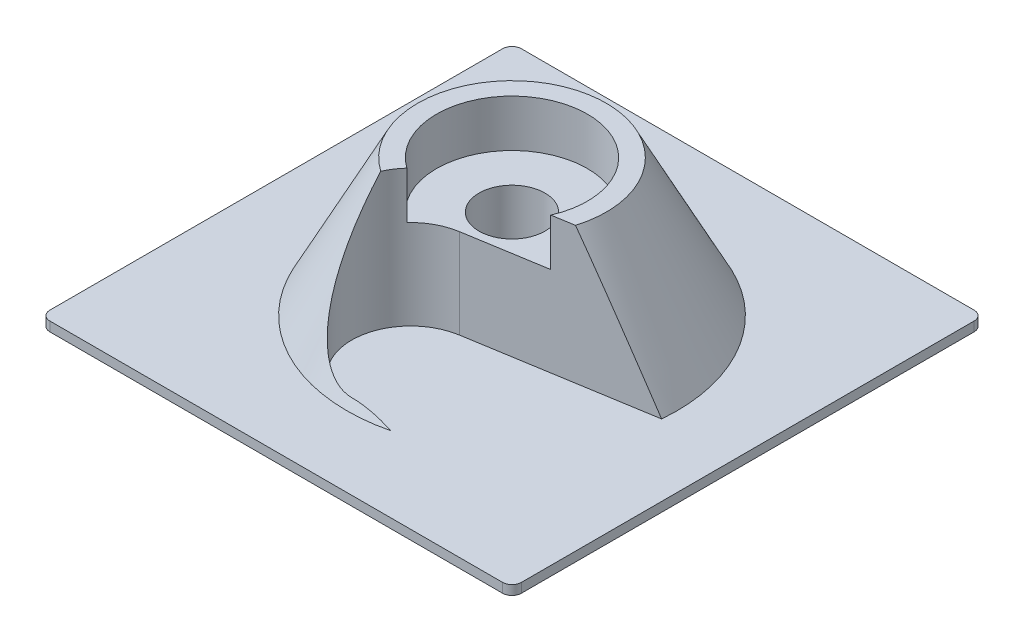
ISO-10303-21;
HEADER;
FILE_DESCRIPTION(('STEP AP214'),'2;1');
FILE_NAME('part.step','',(''),(''),'','','');
FILE_SCHEMA(('AUTOMOTIVE_DESIGN { 1 0 10303 214 1 1 1 1 }'));
ENDSEC;
DATA;
#1=APPLICATION_CONTEXT('core data for automotive mechanical design processes');
#2=APPLICATION_PROTOCOL_DEFINITION('international standard','automotive_design',2000,#1);
#3=PRODUCT_CONTEXT('',#1,'mechanical');
#4=PRODUCT('Part','Part','',(#3));
#5=PRODUCT_RELATED_PRODUCT_CATEGORY('part','',(#4));
#6=PRODUCT_DEFINITION_FORMATION('','',#4);
#7=PRODUCT_DEFINITION_CONTEXT('part definition',#1,'design');
#8=PRODUCT_DEFINITION('design','',#6,#7);
#9=PRODUCT_DEFINITION_SHAPE('','',#8);
#10=(LENGTH_UNIT() NAMED_UNIT(*) SI_UNIT(.MILLI.,.METRE.));
#11=(NAMED_UNIT(*) PLANE_ANGLE_UNIT() SI_UNIT($,.RADIAN.));
#12=(NAMED_UNIT(*) SI_UNIT($,.STERADIAN.) SOLID_ANGLE_UNIT());
#13=UNCERTAINTY_MEASURE_WITH_UNIT(LENGTH_MEASURE(1.E-05),#10,'distance_accuracy_value','');
#14=(GEOMETRIC_REPRESENTATION_CONTEXT(3) GLOBAL_UNCERTAINTY_ASSIGNED_CONTEXT((#13)) GLOBAL_UNIT_ASSIGNED_CONTEXT((#10,
#11,#12)) REPRESENTATION_CONTEXT('',''));
#15=CARTESIAN_POINT('',(0.,0.,0.));
#16=DIRECTION('',(0.,0.,1.));
#17=DIRECTION('',(1.,0.,0.));
#18=AXIS2_PLACEMENT_3D('',#15,#16,#17);
#19=CARTESIAN_POINT('',(24.,0.5,-24.));
#20=DIRECTION('',(0.,-1.,0.));
#21=DIRECTION('',(0.,0.,-1.));
#22=AXIS2_PLACEMENT_3D('',#19,#20,#21);
#23=PLANE('',#22);
#24=DIRECTION('',(0.,0.,-1.));
#25=VECTOR('',#24,1.);
#26=CARTESIAN_POINT('',(25.,0.5,-24.));
#27=LINE('',#26,#25);
#28=CARTESIAN_POINT('',(25.,0.5,24.));
#29=VERTEX_POINT('',#28);
#30=CARTESIAN_POINT('',(25.,0.5,-24.));
#31=VERTEX_POINT('',#30);
#32=EDGE_CURVE('E225',#29,#31,#27,.T.);
#33=ORIENTED_EDGE('',*,*,#32,.T.);
#34=CARTESIAN_POINT('',(24.,0.5,-24.));
#35=DIRECTION('',(0.,1.,0.));
#36=DIRECTION('',(0.,0.,-1.));
#37=AXIS2_PLACEMENT_3D('',#34,#35,#36);
#38=CIRCLE('',#37,1.);
#39=CARTESIAN_POINT('',(24.,0.5,-25.));
#40=VERTEX_POINT('',#39);
#41=EDGE_CURVE('E204',#31,#40,#38,.T.);
#42=ORIENTED_EDGE('',*,*,#41,.T.);
#43=DIRECTION('',(-1.,0.,0.));
#44=VECTOR('',#43,1.);
#45=CARTESIAN_POINT('',(-24.,0.5,-25.));
#46=LINE('',#45,#44);
#47=CARTESIAN_POINT('',(-24.,0.5,-25.));
#48=VERTEX_POINT('',#47);
#49=EDGE_CURVE('E207',#40,#48,#46,.T.);
#50=ORIENTED_EDGE('',*,*,#49,.T.);
#51=CARTESIAN_POINT('',(-24.,0.5,-24.));
#52=DIRECTION('',(0.,1.,0.));
#53=DIRECTION('',(0.,0.,1.));
#54=AXIS2_PLACEMENT_3D('',#51,#52,#53);
#55=CIRCLE('',#54,1.);
#56=CARTESIAN_POINT('',(-25.,0.5,-24.));
#57=VERTEX_POINT('',#56);
#58=EDGE_CURVE('E210',#48,#57,#55,.T.);
#59=ORIENTED_EDGE('',*,*,#58,.T.);
#60=DIRECTION('',(0.,0.,1.));
#61=VECTOR('',#60,1.);
#62=CARTESIAN_POINT('',(-25.,0.5,-24.));
#63=LINE('',#62,#61);
#64=CARTESIAN_POINT('',(-25.,0.5,24.));
#65=VERTEX_POINT('',#64);
#66=EDGE_CURVE('E213',#57,#65,#63,.T.);
#67=ORIENTED_EDGE('',*,*,#66,.T.);
#68=CARTESIAN_POINT('',(-24.,0.5,24.));
#69=DIRECTION('',(0.,1.,0.));
#70=DIRECTION('',(0.,0.,1.));
#71=AXIS2_PLACEMENT_3D('',#68,#69,#70);
#72=CIRCLE('',#71,1.);
#73=CARTESIAN_POINT('',(-24.,0.5,25.));
#74=VERTEX_POINT('',#73);
#75=EDGE_CURVE('E216',#65,#74,#72,.T.);
#76=ORIENTED_EDGE('',*,*,#75,.T.);
#77=DIRECTION('',(1.,0.,0.));
#78=VECTOR('',#77,1.);
#79=CARTESIAN_POINT('',(-24.,0.5,25.));
#80=LINE('',#79,#78);
#81=CARTESIAN_POINT('',(24.,0.5,25.));
#82=VERTEX_POINT('',#81);
#83=EDGE_CURVE('E219',#74,#82,#80,.T.);
#84=ORIENTED_EDGE('',*,*,#83,.T.);
#85=CARTESIAN_POINT('',(24.,0.5,24.));
#86=DIRECTION('',(0.,1.,0.));
#87=DIRECTION('',(0.,0.,1.));
#88=AXIS2_PLACEMENT_3D('',#85,#86,#87);
#89=CIRCLE('',#88,1.);
#90=EDGE_CURVE('E222',#82,#29,#89,.T.);
#91=ORIENTED_EDGE('',*,*,#90,.T.);
#92=EDGE_LOOP('',(#33,#42,#50,#59,#67,#76,#84,#91));
#93=FACE_BOUND('',#92,.T.);
#94=CARTESIAN_POINT('',(0.,0.5,0.));
#95=DIRECTION('',(0.,-1.,0.));
#96=DIRECTION('',(0.,0.,-1.));
#97=AXIS2_PLACEMENT_3D('',#94,#95,#96);
#98=CIRCLE('',#97,17.5);
#99=CARTESIAN_POINT('',(17.4300159357366,0.5,1.56350391108167));
#100=VERTEX_POINT('',#99);
#101=CARTESIAN_POINT('',(4.15331193145899,0.5,17.));
#102=VERTEX_POINT('',#101);
#103=EDGE_CURVE('E146',#100,#102,#98,.F.);
#104=ORIENTED_EDGE('',*,*,#103,.F.);
#105=DIRECTION('',(-0.986864458788351,0.,0.161550425503539));
#106=VECTOR('',#105,1.);
#107=CARTESIAN_POINT('',(25.,0.5,0.324292045920119));
#108=LINE('',#107,#106);
#109=CARTESIAN_POINT('',(-1.00969015939713,0.5,4.58209713257282));
#110=VERTEX_POINT('',#109);
#111=EDGE_CURVE('E142',#100,#110,#108,.T.);
#112=ORIENTED_EDGE('',*,*,#111,.T.);
#113=CARTESIAN_POINT('',(0.,0.5,10.75));
#114=DIRECTION('',(0.,-1.,0.));
#115=DIRECTION('',(0.,0.,-1.));
#116=AXIS2_PLACEMENT_3D('',#113,#114,#115);
#117=CIRCLE('',#116,6.25);
#118=CARTESIAN_POINT('',(0.,0.5,17.));
#119=VERTEX_POINT('',#118);
#120=EDGE_CURVE('E144',#110,#119,#117,.F.);
#121=ORIENTED_EDGE('',*,*,#120,.T.);
#122=DIRECTION('',(1.,0.,0.));
#123=VECTOR('',#122,1.);
#124=CARTESIAN_POINT('',(0.,0.5,17.));
#125=LINE('',#124,#123);
#126=EDGE_CURVE('E166',#119,#102,#125,.T.);
#127=ORIENTED_EDGE('',*,*,#126,.T.);
#128=EDGE_LOOP('',(#104,#112,#121,#127));
#129=FACE_BOUND('',#128,.T.);
#130=ADVANCED_FACE('F33',(#93,#129),#23,.F.);
#131=CARTESIAN_POINT('',(24.,-0.5,-24.));
#132=DIRECTION('',(0.,1.,0.));
#133=DIRECTION('',(0.,0.,1.));
#134=AXIS2_PLACEMENT_3D('',#131,#132,#133);
#135=CYLINDRICAL_SURFACE('',#134,1.);
#136=DIRECTION('',(0.,1.,0.));
#137=VECTOR('',#136,1.);
#138=CARTESIAN_POINT('',(24.,-0.5,-25.));
#139=LINE('',#138,#137);
#140=CARTESIAN_POINT('',(24.,-0.5,-25.));
#141=VERTEX_POINT('',#140);
#142=EDGE_CURVE('E253',#141,#40,#139,.T.);
#143=ORIENTED_EDGE('',*,*,#142,.T.);
#144=ORIENTED_EDGE('',*,*,#41,.F.);
#145=DIRECTION('',(0.,1.,0.));
#146=VECTOR('',#145,1.);
#147=CARTESIAN_POINT('',(25.,-0.5,-24.));
#148=LINE('',#147,#146);
#149=CARTESIAN_POINT('',(25.,-0.5,-24.));
#150=VERTEX_POINT('',#149);
#151=EDGE_CURVE('E61',#150,#31,#148,.T.);
#152=ORIENTED_EDGE('',*,*,#151,.F.);
#153=CARTESIAN_POINT('',(24.,-0.5,-24.));
#154=DIRECTION('',(0.,1.,0.));
#155=DIRECTION('',(0.,0.,-1.));
#156=AXIS2_PLACEMENT_3D('',#153,#154,#155);
#157=CIRCLE('',#156,1.);
#158=EDGE_CURVE('E230',#150,#141,#157,.T.);
#159=ORIENTED_EDGE('',*,*,#158,.T.);
#160=EDGE_LOOP('',(#143,#144,#152,#159));
#161=FACE_BOUND('',#160,.T.);
#162=ADVANCED_FACE('F35',(#161),#135,.T.);
#163=CARTESIAN_POINT('',(25.,-0.5,-24.));
#164=DIRECTION('',(1.,0.,0.));
#165=DIRECTION('',(0.,0.,-1.));
#166=AXIS2_PLACEMENT_3D('',#163,#164,#165);
#167=PLANE('',#166);
#168=ORIENTED_EDGE('',*,*,#151,.T.);
#169=ORIENTED_EDGE('',*,*,#32,.F.);
#170=DIRECTION('',(0.,1.,0.));
#171=VECTOR('',#170,1.);
#172=CARTESIAN_POINT('',(25.,-0.5,24.));
#173=LINE('',#172,#171);
#174=CARTESIAN_POINT('',(25.,-0.5,24.));
#175=VERTEX_POINT('',#174);
#176=EDGE_CURVE('E255',#175,#29,#173,.T.);
#177=ORIENTED_EDGE('',*,*,#176,.F.);
#178=DIRECTION('',(0.,0.,-1.));
#179=VECTOR('',#178,1.);
#180=CARTESIAN_POINT('',(25.,-0.5,-24.));
#181=LINE('',#180,#179);
#182=EDGE_CURVE('E250',#175,#150,#181,.T.);
#183=ORIENTED_EDGE('',*,*,#182,.T.);
#184=EDGE_LOOP('',(#168,#169,#177,#183));
#185=FACE_BOUND('',#184,.T.);
#186=ADVANCED_FACE('F301',(#185),#167,.T.);
#187=CARTESIAN_POINT('',(24.,-0.5,24.));
#188=DIRECTION('',(0.,1.,0.));
#189=DIRECTION('',(0.,0.,1.));
#190=AXIS2_PLACEMENT_3D('',#187,#188,#189);
#191=CYLINDRICAL_SURFACE('',#190,1.);
#192=ORIENTED_EDGE('',*,*,#176,.T.);
#193=ORIENTED_EDGE('',*,*,#90,.F.);
#194=DIRECTION('',(0.,1.,0.));
#195=VECTOR('',#194,1.);
#196=CARTESIAN_POINT('',(24.,-0.5,25.));
#197=LINE('',#196,#195);
#198=CARTESIAN_POINT('',(24.,-0.5,25.));
#199=VERTEX_POINT('',#198);
#200=EDGE_CURVE('E257',#199,#82,#197,.T.);
#201=ORIENTED_EDGE('',*,*,#200,.F.);
#202=CARTESIAN_POINT('',(24.,-0.5,24.));
#203=DIRECTION('',(0.,1.,0.));
#204=DIRECTION('',(0.,0.,1.));
#205=AXIS2_PLACEMENT_3D('',#202,#203,#204);
#206=CIRCLE('',#205,1.);
#207=EDGE_CURVE('E247',#199,#175,#206,.T.);
#208=ORIENTED_EDGE('',*,*,#207,.T.);
#209=EDGE_LOOP('',(#192,#193,#201,#208));
#210=FACE_BOUND('',#209,.T.);
#211=ADVANCED_FACE('F315',(#210),#191,.T.);
#212=CARTESIAN_POINT('',(-24.,-0.5,25.));
#213=DIRECTION('',(0.,0.,1.));
#214=DIRECTION('',(1.,0.,0.));
#215=AXIS2_PLACEMENT_3D('',#212,#213,#214);
#216=PLANE('',#215);
#217=ORIENTED_EDGE('',*,*,#200,.T.);
#218=ORIENTED_EDGE('',*,*,#83,.F.);
#219=DIRECTION('',(0.,1.,0.));
#220=VECTOR('',#219,1.);
#221=CARTESIAN_POINT('',(-24.,-0.5,25.));
#222=LINE('',#221,#220);
#223=CARTESIAN_POINT('',(-24.,-0.5,25.));
#224=VERTEX_POINT('',#223);
#225=EDGE_CURVE('E259',#224,#74,#222,.T.);
#226=ORIENTED_EDGE('',*,*,#225,.F.);
#227=DIRECTION('',(1.,0.,0.));
#228=VECTOR('',#227,1.);
#229=CARTESIAN_POINT('',(-24.,-0.5,25.));
#230=LINE('',#229,#228);
#231=EDGE_CURVE('E244',#224,#199,#230,.T.);
#232=ORIENTED_EDGE('',*,*,#231,.T.);
#233=EDGE_LOOP('',(#217,#218,#226,#232));
#234=FACE_BOUND('',#233,.T.);
#235=ADVANCED_FACE('F319',(#234),#216,.T.);
#236=CARTESIAN_POINT('',(-24.,-0.5,24.));
#237=DIRECTION('',(0.,1.,0.));
#238=DIRECTION('',(0.,0.,1.));
#239=AXIS2_PLACEMENT_3D('',#236,#237,#238);
#240=CYLINDRICAL_SURFACE('',#239,1.);
#241=ORIENTED_EDGE('',*,*,#225,.T.);
#242=ORIENTED_EDGE('',*,*,#75,.F.);
#243=DIRECTION('',(0.,1.,0.));
#244=VECTOR('',#243,1.);
#245=CARTESIAN_POINT('',(-25.,-0.5,24.));
#246=LINE('',#245,#244);
#247=CARTESIAN_POINT('',(-25.,-0.5,24.));
#248=VERTEX_POINT('',#247);
#249=EDGE_CURVE('E261',#248,#65,#246,.T.);
#250=ORIENTED_EDGE('',*,*,#249,.F.);
#251=CARTESIAN_POINT('',(-24.,-0.5,24.));
#252=DIRECTION('',(0.,1.,0.));
#253=DIRECTION('',(0.,0.,1.));
#254=AXIS2_PLACEMENT_3D('',#251,#252,#253);
#255=CIRCLE('',#254,1.);
#256=EDGE_CURVE('E241',#248,#224,#255,.T.);
#257=ORIENTED_EDGE('',*,*,#256,.T.);
#258=EDGE_LOOP('',(#241,#242,#250,#257));
#259=FACE_BOUND('',#258,.T.);
#260=ADVANCED_FACE('F323',(#259),#240,.T.);
#261=CARTESIAN_POINT('',(-25.,-0.5,-24.));
#262=DIRECTION('',(-1.,0.,0.));
#263=DIRECTION('',(0.,0.,1.));
#264=AXIS2_PLACEMENT_3D('',#261,#262,#263);
#265=PLANE('',#264);
#266=ORIENTED_EDGE('',*,*,#249,.T.);
#267=ORIENTED_EDGE('',*,*,#66,.F.);
#268=DIRECTION('',(0.,1.,0.));
#269=VECTOR('',#268,1.);
#270=CARTESIAN_POINT('',(-25.,-0.5,-24.));
#271=LINE('',#270,#269);
#272=CARTESIAN_POINT('',(-25.,-0.5,-24.));
#273=VERTEX_POINT('',#272);
#274=EDGE_CURVE('E263',#273,#57,#271,.T.);
#275=ORIENTED_EDGE('',*,*,#274,.F.);
#276=DIRECTION('',(0.,0.,1.));
#277=VECTOR('',#276,1.);
#278=CARTESIAN_POINT('',(-25.,-0.5,-24.));
#279=LINE('',#278,#277);
#280=EDGE_CURVE('E238',#273,#248,#279,.T.);
#281=ORIENTED_EDGE('',*,*,#280,.T.);
#282=EDGE_LOOP('',(#266,#267,#275,#281));
#283=FACE_BOUND('',#282,.T.);
#284=ADVANCED_FACE('F327',(#283),#265,.T.);
#285=CARTESIAN_POINT('',(-24.,-0.5,-24.));
#286=DIRECTION('',(0.,1.,0.));
#287=DIRECTION('',(0.,0.,1.));
#288=AXIS2_PLACEMENT_3D('',#285,#286,#287);
#289=CYLINDRICAL_SURFACE('',#288,1.);
#290=ORIENTED_EDGE('',*,*,#274,.T.);
#291=ORIENTED_EDGE('',*,*,#58,.F.);
#292=DIRECTION('',(0.,1.,0.));
#293=VECTOR('',#292,1.);
#294=CARTESIAN_POINT('',(-24.,-0.5,-25.));
#295=LINE('',#294,#293);
#296=CARTESIAN_POINT('',(-24.,-0.5,-25.));
#297=VERTEX_POINT('',#296);
#298=EDGE_CURVE('E265',#297,#48,#295,.T.);
#299=ORIENTED_EDGE('',*,*,#298,.F.);
#300=CARTESIAN_POINT('',(-24.,-0.5,-24.));
#301=DIRECTION('',(0.,1.,0.));
#302=DIRECTION('',(0.,0.,1.));
#303=AXIS2_PLACEMENT_3D('',#300,#301,#302);
#304=CIRCLE('',#303,1.);
#305=EDGE_CURVE('E235',#297,#273,#304,.T.);
#306=ORIENTED_EDGE('',*,*,#305,.T.);
#307=EDGE_LOOP('',(#290,#291,#299,#306));
#308=FACE_BOUND('',#307,.T.);
#309=ADVANCED_FACE('F331',(#308),#289,.T.);
#310=CARTESIAN_POINT('',(-24.,-0.5,-25.));
#311=DIRECTION('',(0.,0.,-1.));
#312=DIRECTION('',(-1.,0.,0.));
#313=AXIS2_PLACEMENT_3D('',#310,#311,#312);
#314=PLANE('',#313);
#315=ORIENTED_EDGE('',*,*,#298,.T.);
#316=ORIENTED_EDGE('',*,*,#49,.F.);
#317=ORIENTED_EDGE('',*,*,#142,.F.);
#318=DIRECTION('',(-1.,0.,0.));
#319=VECTOR('',#318,1.);
#320=CARTESIAN_POINT('',(-24.,-0.5,-25.));
#321=LINE('',#320,#319);
#322=EDGE_CURVE('E232',#141,#297,#321,.T.);
#323=ORIENTED_EDGE('',*,*,#322,.T.);
#324=EDGE_LOOP('',(#315,#316,#317,#323));
#325=FACE_BOUND('',#324,.T.);
#326=ADVANCED_FACE('F311',(#325),#314,.T.);
#327=CARTESIAN_POINT('',(24.,-0.5,-24.));
#328=DIRECTION('',(0.,-1.,0.));
#329=DIRECTION('',(0.,0.,-1.));
#330=AXIS2_PLACEMENT_3D('',#327,#328,#329);
#331=PLANE('',#330);
#332=CARTESIAN_POINT('',(0.,-0.5,0.));
#333=DIRECTION('',(0.,1.,0.));
#334=DIRECTION('',(0.,0.,1.));
#335=AXIS2_PLACEMENT_3D('',#332,#333,#334);
#336=CIRCLE('',#335,3.5);
#337=CARTESIAN_POINT('',(0.,-0.5,3.5));
#338=VERTEX_POINT('',#337);
#339=EDGE_CURVE('E227',#338,#338,#336,.T.);
#340=ORIENTED_EDGE('',*,*,#339,.T.);
#341=EDGE_LOOP('',(#340));
#342=FACE_BOUND('',#341,.T.);
#343=ORIENTED_EDGE('',*,*,#158,.F.);
#344=ORIENTED_EDGE('',*,*,#182,.F.);
#345=ORIENTED_EDGE('',*,*,#207,.F.);
#346=ORIENTED_EDGE('',*,*,#231,.F.);
#347=ORIENTED_EDGE('',*,*,#256,.F.);
#348=ORIENTED_EDGE('',*,*,#280,.F.);
#349=ORIENTED_EDGE('',*,*,#305,.F.);
#350=ORIENTED_EDGE('',*,*,#322,.F.);
#351=EDGE_LOOP('',(#343,#344,#345,#346,#347,#348,#349,#350));
#352=FACE_BOUND('',#351,.T.);
#353=ADVANCED_FACE('F307',(#342,#352),#331,.T.);
#354=CARTESIAN_POINT('',(0.,-0.5,0.));
#355=DIRECTION('',(0.,1.,0.));
#356=DIRECTION('',(0.,0.,1.));
#357=AXIS2_PLACEMENT_3D('',#354,#355,#356);
#358=CYLINDRICAL_SURFACE('',#357,3.5);
#359=ORIENTED_EDGE('',*,*,#339,.F.);
#360=EDGE_LOOP('',(#359));
#361=FACE_BOUND('',#360,.T.);
#362=CARTESIAN_POINT('',(0.,10.,0.));
#363=DIRECTION('',(0.,-1.,0.));
#364=DIRECTION('',(1.,0.,0.));
#365=AXIS2_PLACEMENT_3D('',#362,#363,#364);
#366=CIRCLE('',#365,3.5);
#367=CARTESIAN_POINT('',(3.5,10.,0.));
#368=VERTEX_POINT('',#367);
#369=EDGE_CURVE('E195',#368,#368,#366,.T.);
#370=ORIENTED_EDGE('',*,*,#369,.F.);
#371=EDGE_LOOP('',(#370));
#372=FACE_BOUND('',#371,.T.);
#373=ADVANCED_FACE('F304',(#361,#372),#358,.F.);
#374=CARTESIAN_POINT('',(0.,0.5,0.));
#375=DIRECTION('',(0.,-1.,0.));
#376=DIRECTION('',(1.,0.,0.));
#377=AXIS2_PLACEMENT_3D('',#374,#375,#376);
#378=CYLINDRICAL_SURFACE('',#377,8.);
#379=CARTESIAN_POINT('',(0.,10.,0.));
#380=DIRECTION('',(0.,-1.,0.));
#381=DIRECTION('',(1.,0.,0.));
#382=AXIS2_PLACEMENT_3D('',#379,#380,#381);
#383=CIRCLE('',#382,8.);
#384=CARTESIAN_POINT('',(-4.6146825192987,10.,6.53488372093024));
#385=VERTEX_POINT('',#384);
#386=CARTESIAN_POINT('',(7.32432087497665,10.,3.2178134999377));
#387=VERTEX_POINT('',#386);
#388=EDGE_CURVE('E192',#385,#387,#383,.T.);
#389=ORIENTED_EDGE('',*,*,#388,.T.);
#390=DIRECTION('',(0.,-1.,0.));
#391=VECTOR('',#390,1.);
#392=CARTESIAN_POINT('',(7.32432087497665,0.499999999999998,3.2178134999377));
#393=LINE('',#392,#391);
#394=CARTESIAN_POINT('',(7.32432087497666,15.,3.21781349993769));
#395=VERTEX_POINT('',#394);
#396=EDGE_CURVE('E173',#387,#395,#393,.F.);
#397=ORIENTED_EDGE('',*,*,#396,.T.);
#398=CARTESIAN_POINT('',(0.,15.,0.));
#399=DIRECTION('',(0.,-1.,0.));
#400=DIRECTION('',(1.,0.,0.));
#401=AXIS2_PLACEMENT_3D('',#398,#399,#400);
#402=CIRCLE('',#401,8.);
#403=CARTESIAN_POINT('',(-4.6146825192987,15.,6.53488372093024));
#404=VERTEX_POINT('',#403);
#405=EDGE_CURVE('E201',#404,#395,#402,.T.);
#406=ORIENTED_EDGE('',*,*,#405,.F.);
#407=DIRECTION('',(0.,1.,0.));
#408=VECTOR('',#407,1.);
#409=CARTESIAN_POINT('',(-4.6146825192987,7.75,6.53488372093024));
#410=LINE('',#409,#408);
#411=EDGE_CURVE('E162',#404,#385,#410,.F.);
#412=ORIENTED_EDGE('',*,*,#411,.T.);
#413=EDGE_LOOP('',(#389,#397,#406,#412));
#414=FACE_BOUND('',#413,.T.);
#415=ADVANCED_FACE('F275',(#414),#378,.F.);
#416=CARTESIAN_POINT('',(-8.,15.,0.));
#417=DIRECTION('',(0.,-1.,0.));
#418=DIRECTION('',(1.,0.,0.));
#419=AXIS2_PLACEMENT_3D('',#416,#417,#418);
#420=PLANE('',#419);
#421=ORIENTED_EDGE('',*,*,#405,.T.);
#422=DIRECTION('',(-0.986864458788351,0.,0.161550425503539));
#423=VECTOR('',#422,1.);
#424=CARTESIAN_POINT('',(25.,15.,0.324292045920118));
#425=LINE('',#424,#423);
#426=CARTESIAN_POINT('',(9.58599565049368,15.,2.84757570377266));
#427=VERTEX_POINT('',#426);
#428=EDGE_CURVE('E282',#427,#395,#425,.T.);
#429=ORIENTED_EDGE('',*,*,#428,.F.);
#430=CARTESIAN_POINT('',(0.,15.,0.));
#431=DIRECTION('',(0.,-1.,0.));
#432=DIRECTION('',(1.,0.,0.));
#433=AXIS2_PLACEMENT_3D('',#430,#431,#432);
#434=CIRCLE('',#433,10.);
#435=CARTESIAN_POINT('',(-5.71028504780662,15.,8.2093023255814));
#436=VERTEX_POINT('',#435);
#437=EDGE_CURVE('E198',#436,#427,#434,.T.);
#438=ORIENTED_EDGE('',*,*,#437,.F.);
#439=CARTESIAN_POINT('',(0.,15.,10.75));
#440=DIRECTION('',(0.,1.,0.));
#441=DIRECTION('',(-1.,0.,0.));
#442=AXIS2_PLACEMENT_3D('',#439,#440,#441);
#443=CIRCLE('',#442,6.25);
#444=EDGE_CURVE('E149',#404,#436,#443,.T.);
#445=ORIENTED_EDGE('',*,*,#444,.F.);
#446=EDGE_LOOP('',(#421,#429,#438,#445));
#447=FACE_BOUND('',#446,.T.);
#448=ADVANCED_FACE('F280',(#447),#420,.F.);
#449=CARTESIAN_POINT('',(0.,15.,0.));
#450=DIRECTION('',(0.,-1.,0.));
#451=DIRECTION('',(1.,0.,0.));
#452=AXIS2_PLACEMENT_3D('',#449,#450,#451);
#453=CONICAL_SURFACE('',#452,10.,0.477345382373672);
#454=ORIENTED_EDGE('',*,*,#437,.T.);
#455=CARTESIAN_POINT('',(-15.3470974266096,1.77825054070838,6.92914106956849));
#456=CARTESIAN_POINT('',(-15.1248646756753,2.19877740642078,6.89276140754445));
#457=CARTESIAN_POINT('',(-14.9023944210915,2.61917536458195,6.85634286600124));
#458=CARTESIAN_POINT('',(-14.4569081679664,3.45967477272595,6.78341644423436));
#459=CARTESIAN_POINT('',(-14.2338921688993,3.87977622242259,6.74690856392461));
#460=CARTESIAN_POINT('',(-13.5638763100076,5.13965888190951,6.6372264833368));
#461=CARTESIAN_POINT('',(-13.115952129902,5.97893594182008,6.56390097116036));
#462=CARTESIAN_POINT('',(-12.215302729538,7.65858554462599,6.41646401306284));
#463=CARTESIAN_POINT('',(-11.7625662904116,8.49895191383876,6.34235073060495));
#464=CARTESIAN_POINT('',(-10.8526799320693,10.177140865182,6.19340167580716));
#465=CARTESIAN_POINT('',(-10.3955303886547,11.014963656064,6.1185659649862));
#466=CARTESIAN_POINT('',(-9.7021140940029,12.2743537683605,6.00505321614364));
#467=CARTESIAN_POINT('',(-9.46820246651292,12.697252353638,5.96676171358246));
#468=CARTESIAN_POINT('',(-8.99839076184642,13.5419140183588,5.88985319780857));
#469=CARTESIAN_POINT('',(-8.76249068761989,13.9636770994854,5.85123618507878));
#470=CARTESIAN_POINT('',(-8.28818085494709,14.8059022714102,5.77359132249766));
#471=CARTESIAN_POINT('',(-8.04977044417856,15.2263639853827,5.73456336586073));
#472=CARTESIAN_POINT('',(-7.56988363290659,16.0654812260676,5.65600554785023));
#473=CARTESIAN_POINT('',(-7.32840727624818,16.4841367784949,5.61647569365413));
#474=CARTESIAN_POINT('',(-6.84193177233617,17.3184160196959,5.53683930189419));
#475=CARTESIAN_POINT('',(-6.59693908392095,17.7340435669781,5.49673382164685));
#476=CARTESIAN_POINT('',(-6.1018345770025,18.5621484742832,5.41568485585514));
#477=CARTESIAN_POINT('',(-5.85172287636867,18.9746259065405,5.37474138960607));
#478=CARTESIAN_POINT('',(-5.34470474827193,19.7950636793016,5.29174215541275));
#479=CARTESIAN_POINT('',(-5.08780115236728,20.2030258046704,5.24968685099664));
#480=CARTESIAN_POINT('',(-4.69518710451411,20.8101175863942,5.18541564746458));
#481=CARTESIAN_POINT('',(-4.56311343377327,21.0116620081647,5.16379509206207));
#482=CARTESIAN_POINT('',(-4.29602450051181,21.4127370053992,5.12007244055565));
#483=CARTESIAN_POINT('',(-4.16100934146855,21.6122676513447,5.09797036139105));
#484=CARTESIAN_POINT('',(-3.97254759649607,21.8853693550401,5.06711903746272));
#485=CARTESIAN_POINT('',(-3.92064176847558,21.9600337475711,5.05862201588275));
#486=CARTESIAN_POINT('',(-3.81627143413006,22.1089621361884,5.04153651668039));
#487=CARTESIAN_POINT('',(-3.76380691956642,22.1832261263457,5.03294803770933));
#488=CARTESIAN_POINT('',(-3.6055007013437,22.4053656038523,5.00703319531534));
#489=CARTESIAN_POINT('',(-3.49875211343379,22.5525801836731,4.98955837428477));
#490=CARTESIAN_POINT('',(-3.28220223608838,22.8450834876434,4.95410900277651));
#491=CARTESIAN_POINT('',(-3.17239604565522,22.9903684944156,4.93613365000195));
#492=CARTESIAN_POINT('',(-2.94933077006597,23.2781876984887,4.89961770308989));
#493=CARTESIAN_POINT('',(-2.83607187516892,23.4207220466586,4.88107714009795));
#494=CARTESIAN_POINT('',(-2.60483676861766,23.7028923003181,4.84322378594982));
#495=CARTESIAN_POINT('',(-2.48684186549209,23.8425125500441,4.82390793498627));
#496=CARTESIAN_POINT('',(-2.24564018555108,24.1170430144038,4.78442304556743));
#497=CARTESIAN_POINT('',(-2.12243423746256,24.2519539717866,4.76425414277534));
#498=CARTESIAN_POINT('',(-1.86971904802067,24.515172072343,4.72288448352581));
#499=CARTESIAN_POINT('',(-1.74022110559892,24.6434902595832,4.70168557671165));
#500=CARTESIAN_POINT('',(-1.47314900426014,24.8911047987778,4.65796568060314));
#501=CARTESIAN_POINT('',(-1.3355810661167,25.0104079418001,4.63544570965394));
#502=CARTESIAN_POINT('',(-1.05747357479602,25.2302607192542,4.58991931222572));
#503=CARTESIAN_POINT('',(-0.917438219348722,25.3314544574987,4.56699542327969));
#504=CARTESIAN_POINT('',(-0.626431856948247,25.5164912079337,4.51935747132856));
#505=CARTESIAN_POINT('',(-0.475468407736608,25.6003460596093,4.49464464553122));
#506=CARTESIAN_POINT('',(-0.189450971326625,25.729908236502,4.44782338437222));
#507=CARTESIAN_POINT('',(-0.0562793395574079,25.7797334671674,4.42602309195544));
#508=CARTESIAN_POINT('',(0.148071798096991,25.8372362413938,4.39257066295548));
#509=CARTESIAN_POINT('',(0.21692255307521,25.8535278723018,4.38129974457969));
#510=CARTESIAN_POINT('',(0.355771192171571,25.879820138367,4.35857012195842));
#511=CARTESIAN_POINT('',(0.42576851273897,25.8898237742681,4.3471115099666));
#512=CARTESIAN_POINT('',(0.566938207749453,25.9031868533069,4.32400192881384));
#513=CARTESIAN_POINT('',(0.638115492912648,25.906493526917,4.31235015576446));
#514=CARTESIAN_POINT('',(0.780452033897637,25.906161868933,4.28904956108192));
#515=CARTESIAN_POINT('',(0.851611290047082,25.9025236741982,4.27740073939513));
#516=CARTESIAN_POINT('',(0.993320915105567,25.8884537048896,4.25420277130309));
#517=CARTESIAN_POINT('',(1.06387080905654,25.8780170439707,4.24265370264881));
#518=CARTESIAN_POINT('',(1.20378009335315,25.8507820873856,4.21975045164131));
#519=CARTESIAN_POINT('',(1.27313870975313,25.8339798082452,4.20839639598354));
#520=CARTESIAN_POINT('',(1.51042948607175,25.765800861875,4.16955172431566));
#521=CARTESIAN_POINT('',(1.67438884521416,25.6997676478115,4.14271145866533));
#522=CARTESIAN_POINT('',(1.91094331483424,25.5822811990022,4.10398732093642));
#523=CARTESIAN_POINT('',(1.98834684310681,25.5399638370081,4.09131630738785));
#524=CARTESIAN_POINT('',(2.14025049449859,25.4502349920472,4.06644956981377));
#525=CARTESIAN_POINT('',(2.21475089115159,25.4028239905935,4.05425380101057));
#526=CARTESIAN_POINT('',(2.38267627414623,25.2891699443539,4.02676429438781));
#527=CARTESIAN_POINT('',(2.47516023834697,25.2215121865104,4.01162460257316));
#528=CARTESIAN_POINT('',(2.65604735657638,25.0807736126706,3.98201325051986));
#529=CARTESIAN_POINT('',(2.74444863231092,25.0076903401272,3.96754189775932));
#530=CARTESIAN_POINT('',(2.91779678468826,24.8571697992172,3.93916467986742));
#531=CARTESIAN_POINT('',(3.00273767781197,24.7797254984432,3.92525979424246));
#532=CARTESIAN_POINT('',(3.16950204894944,24.6214596283772,3.89796034610024));
#533=CARTESIAN_POINT('',(3.25132512994913,24.5406376317075,3.88456584857447));
#534=CARTESIAN_POINT('',(3.41282976860825,24.3757009772607,3.85812742244227));
#535=CARTESIAN_POINT('',(3.49249215940643,24.291567121769,3.84508663146488));
#536=CARTESIAN_POINT('',(3.64943679058105,24.1210523025257,3.81939468185522));
#537=CARTESIAN_POINT('',(3.72671895760379,24.0346712696719,3.806743535231));
#538=CARTESIAN_POINT('',(3.8791229796553,23.8601531114186,3.7817948866181));
#539=CARTESIAN_POINT('',(3.95424718640533,23.7720180897976,3.76949699965094));
#540=CARTESIAN_POINT('',(4.10267909258596,23.5942008167782,3.74519858927833));
#541=CARTESIAN_POINT('',(4.1759868576394,23.5045186214739,3.73319805513037));
#542=CARTESIAN_POINT('',(4.40880359733093,23.214492953279,3.69508578649351));
#543=CARTESIAN_POINT('',(4.5652361427248,23.0116113453397,3.66947766569645));
#544=CARTESIAN_POINT('',(4.87219374774617,22.6012959909717,3.61922848379397));
#545=CARTESIAN_POINT('',(5.02271780031583,22.3938614778482,3.59458758754465));
#546=CARTESIAN_POINT('',(5.31918750184995,21.9755054823649,3.54605528302681));
#547=CARTESIAN_POINT('',(5.46513073304239,21.7645822454275,3.52216427054933));
#548=CARTESIAN_POINT('',(5.75329583893175,21.3401360730506,3.47499143434358));
#549=CARTESIAN_POINT('',(5.89551754598073,21.1266130211268,3.4517096380594));
#550=CARTESIAN_POINT('',(6.17722420668419,20.6970791575418,3.40559405400067));
#551=CARTESIAN_POINT('',(6.31670279474579,20.4810640674166,3.38276130827828));
#552=CARTESIAN_POINT('',(6.59314527808751,20.0473861514298,3.33750747386018));
#553=CARTESIAN_POINT('',(6.73010913192129,19.8297232984939,3.31508639194928));
#554=CARTESIAN_POINT('',(7.13777938879883,19.1748776810222,3.24835047611281));
#555=CARTESIAN_POINT('',(7.40535707360559,18.7356953301706,3.20454781562501));
#556=CARTESIAN_POINT('',(7.93416630089814,17.8542181610495,3.11798136273623));
#557=CARTESIAN_POINT('',(8.19540557174462,17.411928079036,3.07521630519703));
#558=CARTESIAN_POINT('',(8.71341004393785,16.5246250645096,2.99041859853091));
#559=CARTESIAN_POINT('',(8.97017490905645,16.0796119307398,2.94838600444479));
#560=CARTESIAN_POINT('',(9.47992727315464,15.1881208299729,2.86493917384091));
#561=CARTESIAN_POINT('',(9.73291911704094,14.7416454094423,2.82352422605879));
#562=CARTESIAN_POINT('',(10.2361797653315,13.8471378744886,2.74114009402676));
#563=CARTESIAN_POINT('',(10.4864486372238,13.3991057990115,2.70017089872903));
#564=CARTESIAN_POINT('',(11.0435365252788,12.3960636884579,2.6089752086252));
#565=CARTESIAN_POINT('',(11.349782179994,11.8407268866664,2.55884257350265));
#566=CARTESIAN_POINT('',(11.9596900874548,10.7285976132194,2.45900020802802));
#567=CARTESIAN_POINT('',(12.2633523312018,10.1718051365022,2.40929047914902));
#568=CARTESIAN_POINT('',(12.8686276510658,9.05706455124141,2.31020647161381));
#569=CARTESIAN_POINT('',(13.170240688089,8.49911642091439,2.26083219935727));
#570=CARTESIAN_POINT('',(13.7718026849158,7.3822995049398,2.16235606548834));
#571=CARTESIAN_POINT('',(14.0717516428074,6.82343071823536,2.11325420418896));
#572=CARTESIAN_POINT('',(14.9699136913475,5.14505994229621,1.96622442738359));
#573=CARTESIAN_POINT('',(15.5660919578918,4.02443997653632,1.86862961405488));
#574=CARTESIAN_POINT('',(16.7546737889522,1.78116258694744,1.67405790884895));
#575=CARTESIAN_POINT('',(17.3470773877829,0.6585051817599,1.5770810113544));
#576=CARTESIAN_POINT('',(18.5234849660315,-1.57755768531421,1.38450224013693));
#577=CARTESIAN_POINT('',(19.1075151102198,-2.69094901839619,1.28889608322218));
#578=CARTESIAN_POINT('',(20.2735468250366,-4.9188257360102,1.09801584835127));
#579=CARTESIAN_POINT('',(20.8555483894326,-6.0333111238901,1.00274177141538));
#580=CARTESIAN_POINT('',(22.0175939030917,-8.26236033038695,0.812514080556395));
#581=CARTESIAN_POINT('',(22.5976389140012,-9.37692358089927,0.717560292841022));
#582=CARTESIAN_POINT('',(23.7564789169313,-11.6067108978981,0.527857346406285));
#583=CARTESIAN_POINT('',(24.3352739144842,-12.7219349614321,0.433108186781276));
#584=CARTESIAN_POINT('',(24.9136017005706,-13.8374072672125,0.338435510011165));
#585=B_SPLINE_CURVE_WITH_KNOTS('',3,(#455,#456,#457,#458,#459,#460,#461,#462,#463,#464,#465,
#466,#467,#468,#469,#470,#471,#472,#473,#474,#475,#476,#477,#478,#479,#480,#481,#482,#483,#484,
#485,#486,#487,#488,#489,#490,#491,#492,#493,#494,#495,#496,#497,#498,#499,#500,#501,#502,#503,
#504,#505,#506,#507,#508,#509,#510,#511,#512,#513,#514,#515,#516,#517,#518,#519,#520,#521,#522,
#523,#524,#525,#526,#527,#528,#529,#530,#531,#532,#533,#534,#535,#536,#537,#538,#539,#540,#541,
#542,#543,#544,#545,#546,#547,#548,#549,#550,#551,#552,#553,#554,#555,#556,#557,#558,#559,#560,
#561,#562,#563,#564,#565,#566,#567,#568,#569,#570,#571,#572,#573,#574,#575,#576,#577,#578,#579,
#580,#581,#582,#583,#584),.UNSPECIFIED.,.F.,.F.,(4,2,2,2,2,2,2,2,2,2,2,2,2,2,2,2,2,2,2,2,2,2,2,
2,2,2,2,2,2,2,2,2,2,2,2,2,2,2,2,2,2,2,2,2,2,2,2,2,2,2,2,2,2,2,2,2,2,2,2,2,2,2,2,2,4),(0.,
1.43107754082425,2.86215646103802,5.72459486642148,8.59688646593394,11.4689355937419,
12.9233099073429,14.377682063666,15.8324419599742,17.2871810756421,18.7395236392686,
20.191832799069,21.643545749336,22.3693224940768,23.0950737481244,23.3690618180651,
23.6430539339551,24.191068936897,24.740019622723,25.2889401134623,25.8402947540637,
26.3915620384991,26.9418735425159,27.4917662742543,28.0137820496568,28.5354401920792,
28.9652000089603,29.1798874406981,29.3944723418093,29.6107416134056,29.8270066231288,
30.0434272434195,30.2599835196232,30.7928063997602,31.060073319677,31.3273149964474,
31.67382202804,32.0204869182521,32.3677277918106,32.7150127353514,33.0647462811936,
33.4144905943551,33.7638380668377,34.11317289994,34.8853942876894,35.6577467282171,
36.4305001885382,37.203288400286,37.9776974303683,38.7521192123638,40.300450972948,
41.8467889131033,43.3932425556944,44.9377510919938,46.4822212605468,48.3906896271419,
50.2991646385869,52.2076759573285,54.1161894685131,57.9354284738215,61.7546327096342,
65.5373335848758,69.3200460717249,73.1001876582102,76.8803124801159),.UNSPECIFIED.);
#586=EDGE_CURVE('E187',#427,#100,#585,.T.);
#587=ORIENTED_EDGE('',*,*,#586,.T.);
#588=ORIENTED_EDGE('',*,*,#103,.T.);
#589=CARTESIAN_POINT('',(13.857885429529,-8.06978350148113,17.));
#590=CARTESIAN_POINT('',(13.6521799356221,-7.81852323684736,17.));
#591=CARTESIAN_POINT('',(13.4448410178312,-7.5685898632204,17.));
#592=CARTESIAN_POINT('',(13.0265337162952,-7.07175331568716,17.));
#593=CARTESIAN_POINT('',(12.8155651004447,-6.82485033730573,17.));
#594=CARTESIAN_POINT('',(12.3892819173257,-6.33404562496743,17.));
#595=CARTESIAN_POINT('',(12.1739602636166,-6.09015003612072,17.));
#596=CARTESIAN_POINT('',(11.738928341638,-5.60630001833809,17.));
#597=CARTESIAN_POINT('',(11.5192180755388,-5.36634558745325,17.));
#598=CARTESIAN_POINT('',(11.0693096886752,-4.88492418146927,17.));
#599=CARTESIAN_POINT('',(10.838986917265,-4.64357347882749,17.));
#600=CARTESIAN_POINT('',(10.3726910412389,-4.16639639038504,17.));
#601=CARTESIAN_POINT('',(10.1367180957451,-3.93056984938012,17.));
#602=CARTESIAN_POINT('',(9.65863395732269,-3.46551140521524,17.));
#603=CARTESIAN_POINT('',(9.41652674247279,-3.23627542408298,17.));
#604=CARTESIAN_POINT('',(8.9253483857168,-2.78541506476045,17.));
#605=CARTESIAN_POINT('',(8.67627776232977,-2.56379012255045,17.));
#606=CARTESIAN_POINT('',(8.09806260828582,-2.06746638210491,17.));
#607=CARTESIAN_POINT('',(7.76637855733942,-1.79570307068496,17.));
#608=CARTESIAN_POINT('',(7.08850689168416,-1.27100912896681,17.));
#609=CARTESIAN_POINT('',(6.74232405251975,-1.01807237272041,17.));
#610=CARTESIAN_POINT('',(6.03607056948229,-0.537785771819419,17.));
#611=CARTESIAN_POINT('',(5.67611533107574,-0.310267770604375,17.));
#612=CARTESIAN_POINT('',(4.93890364402634,0.114471648414304,17.));
#613=CARTESIAN_POINT('',(4.56166140865632,0.311717395466569,17.));
#614=CARTESIAN_POINT('',(3.81546451073062,0.655821837521677,17.));
#615=CARTESIAN_POINT('',(3.44767932917915,0.805188552690968,17.));
#616=CARTESIAN_POINT('',(2.6972937701608,1.06318324116878,17.));
#617=CARTESIAN_POINT('',(2.31467744963969,1.17176595320116,17.));
#618=CARTESIAN_POINT('',(1.66074463315527,1.31417298663986,17.));
#619=CARTESIAN_POINT('',(1.39218076063042,1.36076441189921,17.));
#620=CARTESIAN_POINT('',(0.851866971666954,1.42955121405454,17.));
#621=CARTESIAN_POINT('',(0.580116804476928,1.45174465770464,17.));
#622=CARTESIAN_POINT('',(0.0360881699141226,1.47079393175488,17.));
#623=CARTESIAN_POINT('',(-0.236189116963563,1.46768336445328,17.));
#624=CARTESIAN_POINT('',(-0.779277458792523,1.43633885822302,17.));
#625=CARTESIAN_POINT('',(-1.05008852642762,1.40810513697766,17.));
#626=CARTESIAN_POINT('',(-1.58604606613596,1.3279488842202,17.));
#627=CARTESIAN_POINT('',(-1.85121990097941,1.27620730391878,17.));
#628=CARTESIAN_POINT('',(-2.37638121776393,1.15093218995581,17.));
#629=CARTESIAN_POINT('',(-2.63636752986543,1.0773937988676,17.));
#630=CARTESIAN_POINT('',(-3.15159661722445,0.910275929182863,17.));
#631=CARTESIAN_POINT('',(-3.40679871734392,0.816571987835516,17.));
#632=CARTESIAN_POINT('',(-3.91007906757391,0.611865964913644,17.));
#633=CARTESIAN_POINT('',(-4.15815775868018,0.500864956911458,17.));
#634=CARTESIAN_POINT('',(-4.84340860191605,0.168735137568804,17.));
#635=CARTESIAN_POINT('',(-5.27243638594542,-0.0692443488651091,17.));
#636=CARTESIAN_POINT('',(-6.10837975313907,-0.58219057205412,17.));
#637=CARTESIAN_POINT('',(-6.51525392599623,-0.857223448129753,17.));
#638=CARTESIAN_POINT('',(-7.10581835598064,-1.28727863973474,17.));
#639=CARTESIAN_POINT('',(-7.29729163907536,-1.43179229859852,17.));
#640=CARTESIAN_POINT('',(-7.67571803757942,-1.72665724801598,17.));
#641=CARTESIAN_POINT('',(-7.86267086760379,-1.87700890558049,17.));
#642=CARTESIAN_POINT('',(-8.23156052949273,-2.18215424980349,17.));
#643=CARTESIAN_POINT('',(-8.4135153294382,-2.33692629714234,17.));
#644=CARTESIAN_POINT('',(-8.77348706371448,-2.65090244278988,17.));
#645=CARTESIAN_POINT('',(-8.95150492687564,-2.81010547525135,17.));
#646=CARTESIAN_POINT('',(-9.12772520145388,-2.97125226171346,17.));
#647=B_SPLINE_CURVE_WITH_KNOTS('',3,(#589,#590,#591,#592,#593,#594,#595,#596,#597,#598,#599,
#600,#601,#602,#603,#604,#605,#606,#607,#608,#609,#610,#611,#612,#613,#614,#615,#616,#617,#618,
#619,#620,#621,#622,#623,#624,#625,#626,#627,#628,#629,#630,#631,#632,#633,#634,#635,#636,#637,
#638,#639,#640,#641,#642,#643,#644,#645,#646),.UNSPECIFIED.,.F.,.F.,(4,2,2,2,2,2,2,2,2,2,2,2,2,
2,2,2,2,2,2,2,2,2,2,2,2,2,2,2,4),(0.,0.974180754834396,1.94842403803967,2.92440664670769,
3.90038877273593,4.90115006317128,5.90188320288382,6.90198318692624,7.90200889744029,
9.18785970008647,10.4732902555453,11.7496386501261,13.0249558342039,14.213888188514,
15.4041361249112,16.2208647569628,17.0376581002476,17.8533669653146,18.6690687626201,
19.4785953933669,20.2883025632082,21.1031584549132,21.9179637913085,23.3871475047162,
24.8589893036407,25.5785628626592,26.2981817317634,27.0147365644003,27.7311204988242),.UNSPECIFIED.);
#648=CARTESIAN_POINT('',(0.,1.46666666666665,17.));
#649=VERTEX_POINT('',#648);
#650=EDGE_CURVE('E11',#102,#649,#647,.T.);
#651=ORIENTED_EDGE('',*,*,#650,.T.);
#652=CARTESIAN_POINT('',(0.000200000000057641,1.4666666705788,16.9999999968));
#653=CARTESIAN_POINT('',(-0.130314065809165,1.46662013063078,17.0000418386224));
#654=CARTESIAN_POINT('',(-0.260800732321298,1.47165245165072,16.9959218868975));
#655=CARTESIAN_POINT('',(-0.520392802177023,1.49155993100222,16.9796437085407));
#656=CARTESIAN_POINT('',(-0.649499421508815,1.50642554632227,16.967493275337));
#657=CARTESIAN_POINT('',(-0.903972059997054,1.5454877400829,16.9356001804005));
#658=CARTESIAN_POINT('',(-1.02936267902702,1.56958864448796,16.9159353703622));
#659=CARTESIAN_POINT('',(-1.27678644977328,1.62659825629721,16.869489986378));
#660=CARTESIAN_POINT('',(-1.39881899326265,1.65950854785999,16.8427081326075));
#661=CARTESIAN_POINT('',(-1.63823817645682,1.73334952137197,16.7827314042582));
#662=CARTESIAN_POINT('',(-1.75564130236921,1.77424792177595,16.7495623489948));
#663=CARTESIAN_POINT('',(-1.98576664547884,1.86345480677772,16.6773763437359));
#664=CARTESIAN_POINT('',(-2.09848686598978,1.91176641181921,16.6383569313058));
#665=CARTESIAN_POINT('',(-2.42939788305169,2.06694364858404,16.5133459763603));
#666=CARTESIAN_POINT('',(-2.63993996021095,2.18392492841288,16.419505166396));
#667=CARTESIAN_POINT('',(-3.1324193881806,2.49906172548559,16.168368900682));
#668=CARTESIAN_POINT('',(-3.4017150327915,2.7095983748767,16.0019186117258));
#669=CARTESIAN_POINT('',(-3.77120409014445,3.04946099957059,15.7363443553936));
#670=CARTESIAN_POINT('',(-3.88876224871545,3.1669359427072,15.645033536712));
#671=CARTESIAN_POINT('',(-4.11297944120361,3.40874725326825,15.4582018524384));
#672=CARTESIAN_POINT('',(-4.21964061151717,3.53308226835937,15.3626818173558));
#673=CARTESIAN_POINT('',(-4.47909912620877,3.85832275177326,15.114404154991));
#674=CARTESIAN_POINT('',(-4.62455291135079,4.06334583704537,14.9593662932225));
#675=CARTESIAN_POINT('',(-4.89270249893885,4.48429692101457,14.644450675309));
#676=CARTESIAN_POINT('',(-5.01538554616985,4.70023094592696,14.4845702645422));
#677=CARTESIAN_POINT('',(-5.24020997704248,5.14096375509042,14.1619506043089));
#678=CARTESIAN_POINT('',(-5.34232238489979,5.36577451767561,13.9992076684898));
#679=CARTESIAN_POINT('',(-5.5276882248449,5.82222200502313,13.6727344365808));
#680=CARTESIAN_POINT('',(-5.61094323535412,6.05385815664415,13.5090042243076));
#681=CARTESIAN_POINT('',(-5.8093128923665,6.67643345742285,13.0744731635419));
#682=CARTESIAN_POINT('',(-5.90953918364953,7.07226752544109,12.8038381951315));
#683=CARTESIAN_POINT('',(-6.06953021105106,7.87513543526867,12.2671415594505));
#684=CARTESIAN_POINT('',(-6.12926720859364,8.28217675672526,12.0010831488821));
#685=CARTESIAN_POINT('',(-6.21343166330677,9.10547341263839,11.4757286391323));
#686=CARTESIAN_POINT('',(-6.23777421919898,9.5217484782806,11.2164502600606));
#687=CARTESIAN_POINT('',(-6.25504016220504,10.3604202607427,10.7073289778153));
#688=CARTESIAN_POINT('',(-6.24797309955176,10.782815077896,10.4574832299067));
#689=CARTESIAN_POINT('',(-6.21133306357769,11.5209704303279,10.0326445298429));
#690=CARTESIAN_POINT('',(-6.18814406810168,11.8356641310039,9.8551955167932));
#691=CARTESIAN_POINT('',(-6.1276187493167,12.4671514953365,9.50658414219784));
#692=CARTESIAN_POINT('',(-6.09028296209388,12.7839450789721,9.335421542701));
#693=CARTESIAN_POINT('',(-6.00279267514451,13.4166281647514,9.00111148281585));
#694=CARTESIAN_POINT('',(-5.95274473333305,13.7325041178337,8.83791022178138));
#695=CARTESIAN_POINT('',(-5.84045157195574,14.3654995898892,8.51835704717687));
#696=CARTESIAN_POINT('',(-5.77820798489605,14.6826189368601,8.36200422030076));
#697=CARTESIAN_POINT('',(-5.71024223067201,15.0002000000001,8.20920609512499));
#698=B_SPLINE_CURVE_WITH_KNOTS('',3,(#652,#653,#654,#655,#656,#657,#658,#659,#660,#661,#662,
#663,#664,#665,#666,#667,#668,#669,#670,#671,#672,#673,#674,#675,#676,#677,#678,#679,#680,#681,
#682,#683,#684,#685,#686,#687,#688,#689,#690,#691,#692,#693,#694,#695,#696,#697),.UNSPECIFIED.,
.F.,.F.,(4,2,2,2,2,2,2,2,2,2,2,2,2,2,2,2,2,2,2,2,2,2,4),(0.,0.39133615387954,0.782293080108064,
1.16930479721108,1.5563861559683,1.94193445223297,2.32764548498156,3.10034661744704,
4.2343083762502,4.80285169402132,5.37128333192226,6.25593908179503,7.14108889304666,
8.02747693910051,8.91379076434234,10.3810754223068,11.8493642805389,13.3211693719888,
14.792526985237,15.8782587872008,16.9639494499724,18.0408236368298,19.1175537719273),.UNSPECIFIED.);
#699=EDGE_CURVE('E165',#649,#436,#698,.T.);
#700=ORIENTED_EDGE('',*,*,#699,.T.);
#701=EDGE_LOOP('',(#454,#587,#588,#651,#700));
#702=FACE_BOUND('',#701,.T.);
#703=ADVANCED_FACE('F175',(#702),#453,.T.);
#704=CARTESIAN_POINT('',(-8.,10.,0.));
#705=DIRECTION('',(0.,-1.,0.));
#706=DIRECTION('',(1.,0.,0.));
#707=AXIS2_PLACEMENT_3D('',#704,#705,#706);
#708=PLANE('',#707);
#709=CARTESIAN_POINT('',(0.,10.,10.75));
#710=DIRECTION('',(0.,-1.,0.));
#711=DIRECTION('',(1.,0.,0.));
#712=AXIS2_PLACEMENT_3D('',#709,#710,#711);
#713=CIRCLE('',#712,6.25);
#714=CARTESIAN_POINT('',(-1.00969015939712,10.,4.58209713257282));
#715=VERTEX_POINT('',#714);
#716=EDGE_CURVE('E269',#385,#715,#713,.T.);
#717=ORIENTED_EDGE('',*,*,#716,.T.);
#718=DIRECTION('',(0.986864458788351,0.,-0.161550425503539));
#719=VECTOR('',#718,1.);
#720=CARTESIAN_POINT('',(-7.08704682731466,10.,5.57696481363642));
#721=LINE('',#720,#719);
#722=EDGE_CURVE('E46',#715,#387,#721,.T.);
#723=ORIENTED_EDGE('',*,*,#722,.T.);
#724=ORIENTED_EDGE('',*,*,#388,.F.);
#725=EDGE_LOOP('',(#717,#723,#724));
#726=FACE_BOUND('',#725,.T.);
#727=ORIENTED_EDGE('',*,*,#369,.T.);
#728=EDGE_LOOP('',(#727));
#729=FACE_BOUND('',#728,.T.);
#730=ADVANCED_FACE('F186',(#726,#729),#708,.F.);
#731=CARTESIAN_POINT('',(0.,-34.9209222885255,17.));
#732=DIRECTION('',(0.,0.,1.));
#733=DIRECTION('',(1.,0.,0.));
#734=AXIS2_PLACEMENT_3D('',#731,#732,#733);
#735=PLANE('',#734);
#736=ORIENTED_EDGE('',*,*,#126,.F.);
#737=DIRECTION('',(0.,1.,0.));
#738=VECTOR('',#737,1.);
#739=CARTESIAN_POINT('',(0.,-34.9209222885255,17.));
#740=LINE('',#739,#738);
#741=EDGE_CURVE('E154',#119,#649,#740,.T.);
#742=ORIENTED_EDGE('',*,*,#741,.T.);
#743=ORIENTED_EDGE('',*,*,#650,.F.);
#744=EDGE_LOOP('',(#736,#742,#743));
#745=FACE_BOUND('',#744,.T.);
#746=ADVANCED_FACE('F182',(#745),#735,.F.);
#747=CARTESIAN_POINT('',(25.,-34.9209222885255,0.324292045920118));
#748=DIRECTION('',(-0.161550425503539,0.,-0.986864458788351));
#749=DIRECTION('',(-0.986864458788351,0.,0.161550425503539));
#750=AXIS2_PLACEMENT_3D('',#747,#748,#749);
#751=PLANE('',#750);
#752=ORIENTED_EDGE('',*,*,#428,.T.);
#753=ORIENTED_EDGE('',*,*,#396,.F.);
#754=ORIENTED_EDGE('',*,*,#722,.F.);
#755=DIRECTION('',(0.,1.,0.));
#756=VECTOR('',#755,1.);
#757=CARTESIAN_POINT('',(-1.00969015939713,-34.9209222885255,4.58209713257282));
#758=LINE('',#757,#756);
#759=EDGE_CURVE('E53',#110,#715,#758,.T.);
#760=ORIENTED_EDGE('',*,*,#759,.F.);
#761=ORIENTED_EDGE('',*,*,#111,.F.);
#762=ORIENTED_EDGE('',*,*,#586,.F.);
#763=EDGE_LOOP('',(#752,#753,#754,#760,#761,#762));
#764=FACE_BOUND('',#763,.T.);
#765=ADVANCED_FACE('F156',(#764),#751,.F.);
#766=CARTESIAN_POINT('',(0.,-34.9209222885255,10.75));
#767=DIRECTION('',(0.,1.,0.));
#768=DIRECTION('',(-1.,0.,0.));
#769=AXIS2_PLACEMENT_3D('',#766,#767,#768);
#770=CYLINDRICAL_SURFACE('',#769,6.25);
#771=ORIENTED_EDGE('',*,*,#741,.F.);
#772=ORIENTED_EDGE('',*,*,#120,.F.);
#773=ORIENTED_EDGE('',*,*,#759,.T.);
#774=ORIENTED_EDGE('',*,*,#716,.F.);
#775=ORIENTED_EDGE('',*,*,#411,.F.);
#776=ORIENTED_EDGE('',*,*,#444,.T.);
#777=ORIENTED_EDGE('',*,*,#699,.F.);
#778=EDGE_LOOP('',(#771,#772,#773,#774,#775,#776,#777));
#779=FACE_BOUND('',#778,.T.);
#780=ADVANCED_FACE('F152',(#779),#770,.F.);
#781=CLOSED_SHELL('',(#130,#162,#186,#211,#235,#260,#284,#309,#326,#353,#373,#415,#448,#703,
#730,#746,#765,#780));
#782=MANIFOLD_SOLID_BREP('B2',#781);
#783=ADVANCED_BREP_SHAPE_REPRESENTATION('',(#18,#782),#14);
#784=SHAPE_DEFINITION_REPRESENTATION(#9,#783);
ENDSEC;
END-ISO-10303-21;
